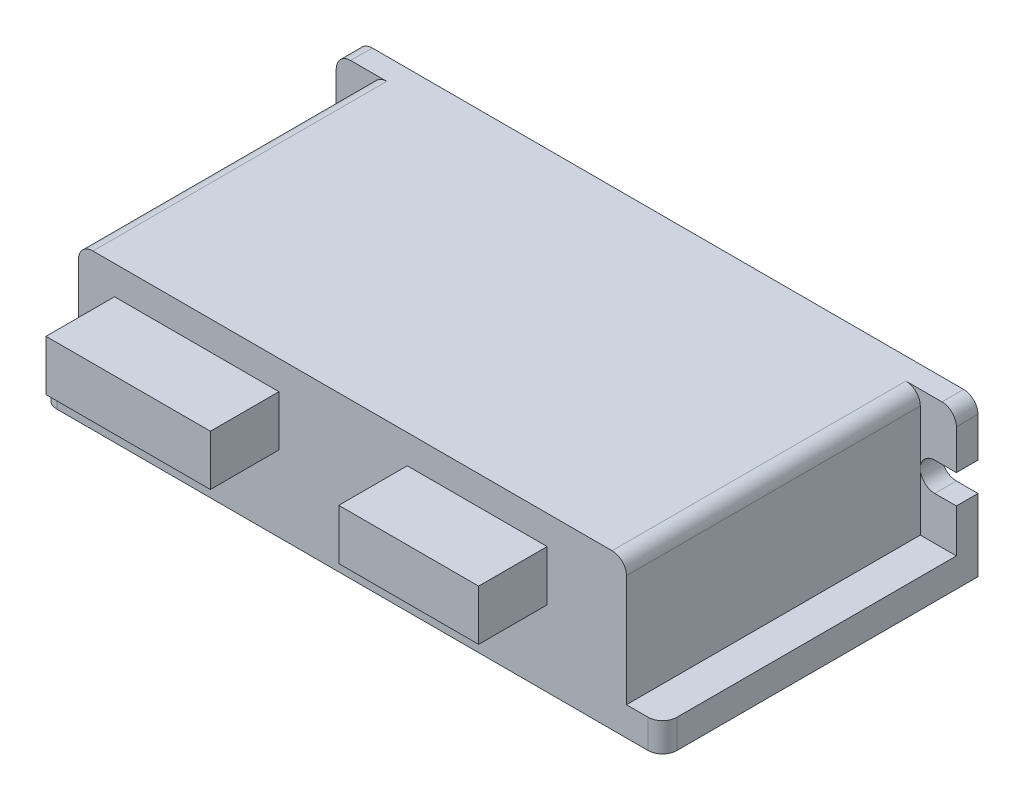
ISO-10303-21;
HEADER;
FILE_DESCRIPTION(('STEP AP214'),'2;1');
FILE_NAME('part.step','',(''),(''),'','','');
FILE_SCHEMA(('AUTOMOTIVE_DESIGN { 1 0 10303 214 1 1 1 1 }'));
ENDSEC;
DATA;
#1=APPLICATION_CONTEXT('core data for automotive mechanical design processes');
#2=APPLICATION_PROTOCOL_DEFINITION('international standard','automotive_design',2000,#1);
#3=PRODUCT_CONTEXT('',#1,'mechanical');
#4=PRODUCT('Part','Part','',(#3));
#5=PRODUCT_RELATED_PRODUCT_CATEGORY('part','',(#4));
#6=PRODUCT_DEFINITION_FORMATION('','',#4);
#7=PRODUCT_DEFINITION_CONTEXT('part definition',#1,'design');
#8=PRODUCT_DEFINITION('design','',#6,#7);
#9=PRODUCT_DEFINITION_SHAPE('','',#8);
#10=(LENGTH_UNIT() NAMED_UNIT(*) SI_UNIT(.MILLI.,.METRE.));
#11=(NAMED_UNIT(*) PLANE_ANGLE_UNIT() SI_UNIT($,.RADIAN.));
#12=(NAMED_UNIT(*) SI_UNIT($,.STERADIAN.) SOLID_ANGLE_UNIT());
#13=UNCERTAINTY_MEASURE_WITH_UNIT(LENGTH_MEASURE(1.E-05),#10,'distance_accuracy_value','');
#14=(GEOMETRIC_REPRESENTATION_CONTEXT(3) GLOBAL_UNCERTAINTY_ASSIGNED_CONTEXT((#13)) GLOBAL_UNIT_ASSIGNED_CONTEXT((#10,
#11,#12)) REPRESENTATION_CONTEXT('',''));
#15=CARTESIAN_POINT('',(0.,0.,0.));
#16=DIRECTION('',(0.,0.,1.));
#17=DIRECTION('',(1.,0.,0.));
#18=AXIS2_PLACEMENT_3D('',#15,#16,#17);
#19=CARTESIAN_POINT('',(0.,0.,43.75));
#20=DIRECTION('',(0.,0.,1.));
#21=DIRECTION('',(1.,0.,0.));
#22=AXIS2_PLACEMENT_3D('',#19,#20,#21);
#23=PLANE('',#22);
#24=DIRECTION('',(1.,0.,0.));
#25=VECTOR('',#24,1.);
#26=CARTESIAN_POINT('',(-43.,-6.75,43.75));
#27=LINE('',#26,#25);
#28=CARTESIAN_POINT('',(-41.,-6.75,43.75));
#29=VERTEX_POINT('',#28);
#30=CARTESIAN_POINT('',(-38.,-6.75,43.75));
#31=VERTEX_POINT('',#30);
#32=EDGE_CURVE('E354',#29,#31,#27,.T.);
#33=ORIENTED_EDGE('',*,*,#32,.F.);
#34=DIRECTION('',(0.,-1.,0.));
#35=VECTOR('',#34,1.);
#36=CARTESIAN_POINT('',(-41.,-10.75,43.75));
#37=LINE('',#36,#35);
#38=CARTESIAN_POINT('',(-41.,-10.75,43.75));
#39=VERTEX_POINT('',#38);
#40=EDGE_CURVE('E433',#29,#39,#37,.T.);
#41=ORIENTED_EDGE('',*,*,#40,.T.);
#42=DIRECTION('',(1.,0.,0.));
#43=VECTOR('',#42,1.);
#44=CARTESIAN_POINT('',(-43.,-10.75,43.75));
#45=LINE('',#44,#43);
#46=CARTESIAN_POINT('',(41.,-10.75,43.75));
#47=VERTEX_POINT('',#46);
#48=EDGE_CURVE('E392',#39,#47,#45,.T.);
#49=ORIENTED_EDGE('',*,*,#48,.T.);
#50=DIRECTION('',(0.,1.,0.));
#51=VECTOR('',#50,1.);
#52=CARTESIAN_POINT('',(41.,-6.75,43.75));
#53=LINE('',#52,#51);
#54=CARTESIAN_POINT('',(41.,-6.75,43.75));
#55=VERTEX_POINT('',#54);
#56=EDGE_CURVE('E430',#47,#55,#53,.T.);
#57=ORIENTED_EDGE('',*,*,#56,.T.);
#58=DIRECTION('',(1.,0.,0.));
#59=VECTOR('',#58,1.);
#60=CARTESIAN_POINT('',(43.,-6.75,43.75));
#61=LINE('',#60,#59);
#62=CARTESIAN_POINT('',(38.,-6.75,43.75));
#63=VERTEX_POINT('',#62);
#64=EDGE_CURVE('E378',#63,#55,#61,.T.);
#65=ORIENTED_EDGE('',*,*,#64,.F.);
#66=DIRECTION('',(0.,-1.,0.));
#67=VECTOR('',#66,1.);
#68=CARTESIAN_POINT('',(38.,10.75,43.75));
#69=LINE('',#68,#67);
#70=CARTESIAN_POINT('',(38.,8.75,43.75));
#71=VERTEX_POINT('',#70);
#72=EDGE_CURVE('E343',#71,#63,#69,.T.);
#73=ORIENTED_EDGE('',*,*,#72,.F.);
#74=CARTESIAN_POINT('',(36.,8.75,43.75));
#75=DIRECTION('',(0.,0.,1.));
#76=DIRECTION('',(1.,0.,0.));
#77=AXIS2_PLACEMENT_3D('',#74,#75,#76);
#78=CIRCLE('',#77,2.);
#79=CARTESIAN_POINT('',(36.,10.75,43.75));
#80=VERTEX_POINT('',#79);
#81=EDGE_CURVE('E426',#71,#80,#78,.T.);
#82=ORIENTED_EDGE('',*,*,#81,.T.);
#83=DIRECTION('',(-1.,0.,0.));
#84=VECTOR('',#83,1.);
#85=CARTESIAN_POINT('',(-43.,10.75,43.75));
#86=LINE('',#85,#84);
#87=CARTESIAN_POINT('',(-36.,10.75,43.75));
#88=VERTEX_POINT('',#87);
#89=EDGE_CURVE('E389',#80,#88,#86,.T.);
#90=ORIENTED_EDGE('',*,*,#89,.T.);
#91=CARTESIAN_POINT('',(-36.,8.75,43.75));
#92=DIRECTION('',(0.,0.,1.));
#93=DIRECTION('',(1.,0.,0.));
#94=AXIS2_PLACEMENT_3D('',#91,#92,#93);
#95=CIRCLE('',#94,2.);
#96=CARTESIAN_POINT('',(-38.,8.75,43.75));
#97=VERTEX_POINT('',#96);
#98=EDGE_CURVE('E428',#88,#97,#95,.T.);
#99=ORIENTED_EDGE('',*,*,#98,.T.);
#100=DIRECTION('',(0.,1.,0.));
#101=VECTOR('',#100,1.);
#102=CARTESIAN_POINT('',(-38.,10.75,43.75));
#103=LINE('',#102,#101);
#104=EDGE_CURVE('E356',#31,#97,#103,.T.);
#105=ORIENTED_EDGE('',*,*,#104,.F.);
#106=EDGE_LOOP('',(#33,#41,#49,#57,#65,#73,#82,#90,#99,#105));
#107=FACE_BOUND('',#106,.T.);
#108=DIRECTION('',(-1.,0.,0.));
#109=VECTOR('',#108,1.);
#110=CARTESIAN_POINT('',(-33.,6.75,43.75));
#111=LINE('',#110,#109);
#112=CARTESIAN_POINT('',(-10.2,6.75,43.75));
#113=VERTEX_POINT('',#112);
#114=CARTESIAN_POINT('',(-33.,6.75,43.75));
#115=VERTEX_POINT('',#114);
#116=EDGE_CURVE('E279',#113,#115,#111,.T.);
#117=ORIENTED_EDGE('',*,*,#116,.F.);
#118=DIRECTION('',(0.,1.,0.));
#119=VECTOR('',#118,1.);
#120=CARTESIAN_POINT('',(-10.2,6.75,43.75));
#121=LINE('',#120,#119);
#122=CARTESIAN_POINT('',(-10.2,-0.249999999999998,43.75));
#123=VERTEX_POINT('',#122);
#124=EDGE_CURVE('E276',#123,#113,#121,.T.);
#125=ORIENTED_EDGE('',*,*,#124,.F.);
#126=DIRECTION('',(1.,0.,0.));
#127=VECTOR('',#126,1.);
#128=CARTESIAN_POINT('',(-33.,-0.249999999999998,43.75));
#129=LINE('',#128,#127);
#130=CARTESIAN_POINT('',(-33.,-0.249999999999998,43.75));
#131=VERTEX_POINT('',#130);
#132=EDGE_CURVE('E288',#131,#123,#129,.T.);
#133=ORIENTED_EDGE('',*,*,#132,.F.);
#134=DIRECTION('',(0.,-1.,0.));
#135=VECTOR('',#134,1.);
#136=CARTESIAN_POINT('',(-33.,6.75,43.75));
#137=LINE('',#136,#135);
#138=EDGE_CURVE('E296',#115,#131,#137,.T.);
#139=ORIENTED_EDGE('',*,*,#138,.F.);
#140=EDGE_LOOP('',(#117,#125,#133,#139));
#141=FACE_BOUND('',#140,.T.);
#142=DIRECTION('',(-1.,0.,0.));
#143=VECTOR('',#142,1.);
#144=CARTESIAN_POINT('',(7.6,6.75,43.75));
#145=LINE('',#144,#143);
#146=CARTESIAN_POINT('',(27.,6.75,43.75));
#147=VERTEX_POINT('',#146);
#148=CARTESIAN_POINT('',(7.6,6.75,43.75));
#149=VERTEX_POINT('',#148);
#150=EDGE_CURVE('E791',#147,#149,#145,.T.);
#151=ORIENTED_EDGE('',*,*,#150,.F.);
#152=DIRECTION('',(0.,1.,0.));
#153=VECTOR('',#152,1.);
#154=CARTESIAN_POINT('',(27.,6.75,43.75));
#155=LINE('',#154,#153);
#156=CARTESIAN_POINT('',(27.,-0.249999999999999,43.75));
#157=VERTEX_POINT('',#156);
#158=EDGE_CURVE('E274',#157,#147,#155,.T.);
#159=ORIENTED_EDGE('',*,*,#158,.F.);
#160=DIRECTION('',(1.,0.,0.));
#161=VECTOR('',#160,1.);
#162=CARTESIAN_POINT('',(7.6,-0.249999999999998,43.75));
#163=LINE('',#162,#161);
#164=CARTESIAN_POINT('',(7.6,-0.249999999999998,43.75));
#165=VERTEX_POINT('',#164);
#166=EDGE_CURVE('E270',#165,#157,#163,.T.);
#167=ORIENTED_EDGE('',*,*,#166,.F.);
#168=DIRECTION('',(0.,-1.,0.));
#169=VECTOR('',#168,1.);
#170=CARTESIAN_POINT('',(7.6,6.75,43.75));
#171=LINE('',#170,#169);
#172=EDGE_CURVE('E788',#149,#165,#171,.T.);
#173=ORIENTED_EDGE('',*,*,#172,.F.);
#174=EDGE_LOOP('',(#151,#159,#167,#173));
#175=FACE_BOUND('',#174,.T.);
#176=ADVANCED_FACE('F36',(#107,#141,#175),#23,.T.);
#177=CARTESIAN_POINT('',(43.,10.75,43.75));
#178=DIRECTION('',(-1.,0.,0.));
#179=DIRECTION('',(0.,0.,1.));
#180=AXIS2_PLACEMENT_3D('',#177,#178,#179);
#181=PLANE('',#180);
#182=DIRECTION('',(0.,0.,1.));
#183=VECTOR('',#182,1.);
#184=CARTESIAN_POINT('',(43.,-6.75,-18.2002747232013));
#185=LINE('',#184,#183);
#186=CARTESIAN_POINT('',(43.,-6.75,3.));
#187=VERTEX_POINT('',#186);
#188=CARTESIAN_POINT('',(43.,-6.75,41.75));
#189=VERTEX_POINT('',#188);
#190=EDGE_CURVE('E382',#187,#189,#185,.T.);
#191=ORIENTED_EDGE('',*,*,#190,.T.);
#192=DIRECTION('',(0.,1.,0.));
#193=VECTOR('',#192,1.);
#194=CARTESIAN_POINT('',(43.,-10.75,41.75));
#195=LINE('',#194,#193);
#196=CARTESIAN_POINT('',(43.,-10.75,41.75));
#197=VERTEX_POINT('',#196);
#198=EDGE_CURVE('E446',#189,#197,#195,.F.);
#199=ORIENTED_EDGE('',*,*,#198,.T.);
#200=DIRECTION('',(0.,0.,-1.));
#201=VECTOR('',#200,1.);
#202=CARTESIAN_POINT('',(43.,-10.75,43.75));
#203=LINE('',#202,#201);
#204=CARTESIAN_POINT('',(43.,-10.75,0.));
#205=VERTEX_POINT('',#204);
#206=EDGE_CURVE('E396',#197,#205,#203,.T.);
#207=ORIENTED_EDGE('',*,*,#206,.T.);
#208=DIRECTION('',(0.,1.,0.));
#209=VECTOR('',#208,1.);
#210=CARTESIAN_POINT('',(43.,10.75,0.));
#211=LINE('',#210,#209);
#212=CARTESIAN_POINT('',(43.,-0.749999999999997,0.));
#213=VERTEX_POINT('',#212);
#214=EDGE_CURVE('E397',#205,#213,#211,.T.);
#215=ORIENTED_EDGE('',*,*,#214,.T.);
#216=DIRECTION('',(0.,0.,1.));
#217=VECTOR('',#216,1.);
#218=CARTESIAN_POINT('',(43.,-0.749999999999997,43.75));
#219=LINE('',#218,#217);
#220=CARTESIAN_POINT('',(43.,-0.749999999999997,3.));
#221=VERTEX_POINT('',#220);
#222=EDGE_CURVE('E340',#213,#221,#219,.T.);
#223=ORIENTED_EDGE('',*,*,#222,.T.);
#224=DIRECTION('',(0.,-1.,0.));
#225=VECTOR('',#224,1.);
#226=CARTESIAN_POINT('',(43.,10.75,3.));
#227=LINE('',#226,#225);
#228=EDGE_CURVE('E374',#221,#187,#227,.T.);
#229=ORIENTED_EDGE('',*,*,#228,.T.);
#230=EDGE_LOOP('',(#191,#199,#207,#215,#223,#229));
#231=FACE_BOUND('',#230,.T.);
#232=ADVANCED_FACE('F542',(#231),#181,.F.);
#233=CARTESIAN_POINT('',(-43.,10.75,43.75));
#234=DIRECTION('',(1.,0.,0.));
#235=DIRECTION('',(0.,0.,-1.));
#236=AXIS2_PLACEMENT_3D('',#233,#234,#235);
#237=PLANE('',#236);
#238=DIRECTION('',(0.,1.,0.));
#239=VECTOR('',#238,1.);
#240=CARTESIAN_POINT('',(-43.,10.75,3.));
#241=LINE('',#240,#239);
#242=CARTESIAN_POINT('',(-43.,3.25,3.));
#243=VERTEX_POINT('',#242);
#244=CARTESIAN_POINT('',(-43.,8.75,3.));
#245=VERTEX_POINT('',#244);
#246=EDGE_CURVE('E349',#243,#245,#241,.T.);
#247=ORIENTED_EDGE('',*,*,#246,.T.);
#248=DIRECTION('',(0.,0.,-1.));
#249=VECTOR('',#248,1.);
#250=CARTESIAN_POINT('',(-43.,8.75,43.75));
#251=LINE('',#250,#249);
#252=CARTESIAN_POINT('',(-43.,8.75,0.));
#253=VERTEX_POINT('',#252);
#254=EDGE_CURVE('E448',#245,#253,#251,.T.);
#255=ORIENTED_EDGE('',*,*,#254,.T.);
#256=DIRECTION('',(0.,-1.,0.));
#257=VECTOR('',#256,1.);
#258=CARTESIAN_POINT('',(-43.,10.75,0.));
#259=LINE('',#258,#257);
#260=CARTESIAN_POINT('',(-43.,3.25,0.));
#261=VERTEX_POINT('',#260);
#262=EDGE_CURVE('E404',#253,#261,#259,.T.);
#263=ORIENTED_EDGE('',*,*,#262,.T.);
#264=DIRECTION('',(0.,0.,1.));
#265=VECTOR('',#264,1.);
#266=CARTESIAN_POINT('',(-43.,3.25,43.75));
#267=LINE('',#266,#265);
#268=EDGE_CURVE('E334',#261,#243,#267,.T.);
#269=ORIENTED_EDGE('',*,*,#268,.T.);
#270=EDGE_LOOP('',(#247,#255,#263,#269));
#271=FACE_BOUND('',#270,.T.);
#272=ADVANCED_FACE('F587',(#271),#237,.F.);
#273=CARTESIAN_POINT('',(0.,0.,3.));
#274=DIRECTION('',(0.,0.,1.));
#275=DIRECTION('',(1.,0.,0.));
#276=AXIS2_PLACEMENT_3D('',#273,#274,#275);
#277=PLANE('',#276);
#278=DIRECTION('',(1.,0.,0.));
#279=VECTOR('',#278,1.);
#280=CARTESIAN_POINT('',(0.,-0.749999999999997,3.));
#281=LINE('',#280,#279);
#282=CARTESIAN_POINT('',(40.,-0.749999999999997,3.));
#283=VERTEX_POINT('',#282);
#284=EDGE_CURVE('E424',#283,#221,#281,.T.);
#285=ORIENTED_EDGE('',*,*,#284,.F.);
#286=CARTESIAN_POINT('',(40.,1.25,3.));
#287=DIRECTION('',(0.,0.,1.));
#288=DIRECTION('',(1.,0.,0.));
#289=AXIS2_PLACEMENT_3D('',#286,#287,#288);
#290=CIRCLE('',#289,2.);
#291=CARTESIAN_POINT('',(38.,1.25,3.));
#292=VERTEX_POINT('',#291);
#293=EDGE_CURVE('E423',#292,#283,#290,.T.);
#294=ORIENTED_EDGE('',*,*,#293,.F.);
#295=DIRECTION('',(0.,1.,0.));
#296=VECTOR('',#295,1.);
#297=CARTESIAN_POINT('',(38.,10.75,3.));
#298=LINE('',#297,#296);
#299=CARTESIAN_POINT('',(38.,-6.74999999999999,3.));
#300=VERTEX_POINT('',#299);
#301=EDGE_CURVE('E368',#300,#292,#298,.T.);
#302=ORIENTED_EDGE('',*,*,#301,.F.);
#303=DIRECTION('',(-1.,0.,0.));
#304=VECTOR('',#303,1.);
#305=CARTESIAN_POINT('',(43.,-6.75,3.));
#306=LINE('',#305,#304);
#307=EDGE_CURVE('E371',#187,#300,#306,.T.);
#308=ORIENTED_EDGE('',*,*,#307,.F.);
#309=ORIENTED_EDGE('',*,*,#228,.F.);
#310=EDGE_LOOP('',(#285,#294,#302,#308,#309));
#311=FACE_BOUND('',#310,.T.);
#312=ADVANCED_FACE('F545',(#311),#277,.T.);
#313=CARTESIAN_POINT('',(0.,0.,3.));
#314=DIRECTION('',(0.,0.,1.));
#315=DIRECTION('',(1.,0.,0.));
#316=AXIS2_PLACEMENT_3D('',#313,#314,#315);
#317=PLANE('',#316);
#318=DIRECTION('',(1.,0.,0.));
#319=VECTOR('',#318,1.);
#320=CARTESIAN_POINT('',(-43.,10.75,3.));
#321=LINE('',#320,#319);
#322=CARTESIAN_POINT('',(-41.,10.75,3.));
#323=VERTEX_POINT('',#322);
#324=CARTESIAN_POINT('',(-36.,10.75,3.));
#325=VERTEX_POINT('',#324);
#326=EDGE_CURVE('E346',#323,#325,#321,.T.);
#327=ORIENTED_EDGE('',*,*,#326,.F.);
#328=CARTESIAN_POINT('',(-41.,8.75,3.));
#329=DIRECTION('',(0.,0.,1.));
#330=DIRECTION('',(1.,0.,0.));
#331=AXIS2_PLACEMENT_3D('',#328,#329,#330);
#332=CIRCLE('',#331,2.);
#333=EDGE_CURVE('E466',#323,#245,#332,.T.);
#334=ORIENTED_EDGE('',*,*,#333,.T.);
#335=ORIENTED_EDGE('',*,*,#246,.F.);
#336=DIRECTION('',(-1.,0.,0.));
#337=VECTOR('',#336,1.);
#338=CARTESIAN_POINT('',(0.,3.25,3.));
#339=LINE('',#338,#337);
#340=CARTESIAN_POINT('',(-40.,3.25,3.));
#341=VERTEX_POINT('',#340);
#342=EDGE_CURVE('E417',#341,#243,#339,.T.);
#343=ORIENTED_EDGE('',*,*,#342,.F.);
#344=CARTESIAN_POINT('',(-40.,1.25,3.));
#345=DIRECTION('',(0.,0.,1.));
#346=DIRECTION('',(1.,0.,0.));
#347=AXIS2_PLACEMENT_3D('',#344,#345,#346);
#348=CIRCLE('',#347,2.);
#349=CARTESIAN_POINT('',(-38.,1.25,3.));
#350=VERTEX_POINT('',#349);
#351=EDGE_CURVE('E416',#350,#341,#348,.T.);
#352=ORIENTED_EDGE('',*,*,#351,.F.);
#353=DIRECTION('',(0.,-1.,0.));
#354=VECTOR('',#353,1.);
#355=CARTESIAN_POINT('',(-38.,10.75,3.));
#356=LINE('',#355,#354);
#357=CARTESIAN_POINT('',(-38.,8.75,3.));
#358=VERTEX_POINT('',#357);
#359=EDGE_CURVE('E344',#358,#350,#356,.T.);
#360=ORIENTED_EDGE('',*,*,#359,.F.);
#361=CARTESIAN_POINT('',(-36.,8.75,3.));
#362=DIRECTION('',(0.,0.,1.));
#363=DIRECTION('',(1.,0.,0.));
#364=AXIS2_PLACEMENT_3D('',#361,#362,#363);
#365=CIRCLE('',#364,2.);
#366=EDGE_CURVE('E44',#358,#325,#365,.F.);
#367=ORIENTED_EDGE('',*,*,#366,.T.);
#368=EDGE_LOOP('',(#327,#334,#335,#343,#352,#360,#367));
#369=FACE_BOUND('',#368,.T.);
#370=ADVANCED_FACE('F482',(#369),#317,.T.);
#371=CARTESIAN_POINT('',(43.,3.25,0.));
#372=VERTEX_POINT('',#371);
#373=CARTESIAN_POINT('',(43.,8.75,0.));
#374=VERTEX_POINT('',#373);
#375=EDGE_CURVE('E367',#372,#374,#211,.T.);
#376=ORIENTED_EDGE('',*,*,#375,.T.);
#377=DIRECTION('',(0.,0.,-1.));
#378=VECTOR('',#377,1.);
#379=CARTESIAN_POINT('',(43.,8.75,43.75));
#380=LINE('',#379,#378);
#381=CARTESIAN_POINT('',(43.,8.75,3.));
#382=VERTEX_POINT('',#381);
#383=EDGE_CURVE('E468',#374,#382,#380,.F.);
#384=ORIENTED_EDGE('',*,*,#383,.T.);
#385=CARTESIAN_POINT('',(43.,3.25,3.));
#386=VERTEX_POINT('',#385);
#387=EDGE_CURVE('E375',#382,#386,#227,.T.);
#388=ORIENTED_EDGE('',*,*,#387,.T.);
#389=DIRECTION('',(0.,0.,-1.));
#390=VECTOR('',#389,1.);
#391=CARTESIAN_POINT('',(43.,3.25,43.75));
#392=LINE('',#391,#390);
#393=EDGE_CURVE('E337',#386,#372,#392,.T.);
#394=ORIENTED_EDGE('',*,*,#393,.T.);
#395=EDGE_LOOP('',(#376,#384,#388,#394));
#396=FACE_BOUND('',#395,.T.);
#397=ADVANCED_FACE('F525',(#396),#181,.F.);
#398=CARTESIAN_POINT('',(-43.,10.75,43.75));
#399=DIRECTION('',(0.,-1.,0.));
#400=DIRECTION('',(0.,0.,-1.));
#401=AXIS2_PLACEMENT_3D('',#398,#399,#400);
#402=PLANE('',#401);
#403=DIRECTION('',(-1.,0.,0.));
#404=VECTOR('',#403,1.);
#405=CARTESIAN_POINT('',(-43.,10.75,0.));
#406=LINE('',#405,#404);
#407=CARTESIAN_POINT('',(41.,10.75,0.));
#408=VERTEX_POINT('',#407);
#409=CARTESIAN_POINT('',(-41.,10.75,0.));
#410=VERTEX_POINT('',#409);
#411=EDGE_CURVE('E400',#408,#410,#406,.T.);
#412=ORIENTED_EDGE('',*,*,#411,.T.);
#413=DIRECTION('',(0.,0.,-1.));
#414=VECTOR('',#413,1.);
#415=CARTESIAN_POINT('',(-41.,10.75,43.75));
#416=LINE('',#415,#414);
#417=EDGE_CURVE('E464',#410,#323,#416,.F.);
#418=ORIENTED_EDGE('',*,*,#417,.T.);
#419=ORIENTED_EDGE('',*,*,#326,.T.);
#420=DIRECTION('',(0.,0.,1.));
#421=VECTOR('',#420,1.);
#422=CARTESIAN_POINT('',(-36.,10.75,43.75));
#423=LINE('',#422,#421);
#424=EDGE_CURVE('E458',#325,#88,#423,.T.);
#425=ORIENTED_EDGE('',*,*,#424,.T.);
#426=ORIENTED_EDGE('',*,*,#89,.F.);
#427=DIRECTION('',(0.,0.,1.));
#428=VECTOR('',#427,1.);
#429=CARTESIAN_POINT('',(36.,10.75,43.75));
#430=LINE('',#429,#428);
#431=CARTESIAN_POINT('',(36.,10.75,3.));
#432=VERTEX_POINT('',#431);
#433=EDGE_CURVE('E455',#80,#432,#430,.F.);
#434=ORIENTED_EDGE('',*,*,#433,.T.);
#435=DIRECTION('',(1.,0.,0.));
#436=VECTOR('',#435,1.);
#437=CARTESIAN_POINT('',(43.,10.75,3.));
#438=LINE('',#437,#436);
#439=CARTESIAN_POINT('',(41.,10.75,3.));
#440=VERTEX_POINT('',#439);
#441=EDGE_CURVE('E357',#432,#440,#438,.T.);
#442=ORIENTED_EDGE('',*,*,#441,.T.);
#443=DIRECTION('',(0.,0.,-1.));
#444=VECTOR('',#443,1.);
#445=CARTESIAN_POINT('',(41.,10.75,43.75));
#446=LINE('',#445,#444);
#447=EDGE_CURVE('E461',#440,#408,#446,.T.);
#448=ORIENTED_EDGE('',*,*,#447,.T.);
#449=EDGE_LOOP('',(#412,#418,#419,#425,#426,#434,#442,#448));
#450=FACE_BOUND('',#449,.T.);
#451=ADVANCED_FACE('F490',(#450),#402,.F.);
#452=DIRECTION('',(0.,0.,-1.));
#453=VECTOR('',#452,1.);
#454=CARTESIAN_POINT('',(-43.,-10.75,43.75));
#455=LINE('',#454,#453);
#456=CARTESIAN_POINT('',(-43.,-10.75,41.75));
#457=VERTEX_POINT('',#456);
#458=CARTESIAN_POINT('',(-43.,-10.75,0.));
#459=VERTEX_POINT('',#458);
#460=EDGE_CURVE('E409',#457,#459,#455,.T.);
#461=ORIENTED_EDGE('',*,*,#460,.F.);
#462=DIRECTION('',(0.,-1.,0.));
#463=VECTOR('',#462,1.);
#464=CARTESIAN_POINT('',(-43.,-6.75,41.75));
#465=LINE('',#464,#463);
#466=CARTESIAN_POINT('',(-43.,-6.75,41.75));
#467=VERTEX_POINT('',#466);
#468=EDGE_CURVE('E440',#457,#467,#465,.F.);
#469=ORIENTED_EDGE('',*,*,#468,.T.);
#470=DIRECTION('',(0.,0.,1.));
#471=VECTOR('',#470,1.);
#472=CARTESIAN_POINT('',(-43.,-6.75,-18.2002747232013));
#473=LINE('',#472,#471);
#474=CARTESIAN_POINT('',(-43.,-6.75,3.));
#475=VERTEX_POINT('',#474);
#476=EDGE_CURVE('E360',#475,#467,#473,.T.);
#477=ORIENTED_EDGE('',*,*,#476,.F.);
#478=CARTESIAN_POINT('',(-43.,-0.749999999999997,3.));
#479=VERTEX_POINT('',#478);
#480=EDGE_CURVE('E350',#475,#479,#241,.T.);
#481=ORIENTED_EDGE('',*,*,#480,.T.);
#482=DIRECTION('',(0.,0.,-1.));
#483=VECTOR('',#482,1.);
#484=CARTESIAN_POINT('',(-43.,-0.749999999999997,43.75));
#485=LINE('',#484,#483);
#486=CARTESIAN_POINT('',(-43.,-0.749999999999997,0.));
#487=VERTEX_POINT('',#486);
#488=EDGE_CURVE('E320',#479,#487,#485,.T.);
#489=ORIENTED_EDGE('',*,*,#488,.T.);
#490=EDGE_CURVE('E403',#487,#459,#259,.T.);
#491=ORIENTED_EDGE('',*,*,#490,.T.);
#492=EDGE_LOOP('',(#461,#469,#477,#481,#489,#491));
#493=FACE_BOUND('',#492,.T.);
#494=ADVANCED_FACE('F566',(#493),#237,.F.);
#495=CARTESIAN_POINT('',(-43.,-10.75,43.75));
#496=DIRECTION('',(0.,1.,0.));
#497=DIRECTION('',(0.,0.,1.));
#498=AXIS2_PLACEMENT_3D('',#495,#496,#497);
#499=PLANE('',#498);
#500=ORIENTED_EDGE('',*,*,#48,.F.);
#501=CARTESIAN_POINT('',(-41.,-10.75,41.75));
#502=DIRECTION('',(0.,1.,0.));
#503=DIRECTION('',(0.,0.,1.));
#504=AXIS2_PLACEMENT_3D('',#501,#502,#503);
#505=CIRCLE('',#504,2.);
#506=EDGE_CURVE('E438',#39,#457,#505,.F.);
#507=ORIENTED_EDGE('',*,*,#506,.T.);
#508=ORIENTED_EDGE('',*,*,#460,.T.);
#509=DIRECTION('',(1.,0.,0.));
#510=VECTOR('',#509,1.);
#511=CARTESIAN_POINT('',(-43.,-10.75,0.));
#512=LINE('',#511,#510);
#513=EDGE_CURVE('E393',#459,#205,#512,.T.);
#514=ORIENTED_EDGE('',*,*,#513,.T.);
#515=ORIENTED_EDGE('',*,*,#206,.F.);
#516=CARTESIAN_POINT('',(41.,-10.75,41.75));
#517=DIRECTION('',(0.,1.,0.));
#518=DIRECTION('',(0.,0.,1.));
#519=AXIS2_PLACEMENT_3D('',#516,#517,#518);
#520=CIRCLE('',#519,2.);
#521=EDGE_CURVE('E436',#197,#47,#520,.F.);
#522=ORIENTED_EDGE('',*,*,#521,.T.);
#523=EDGE_LOOP('',(#500,#507,#508,#514,#515,#522));
#524=FACE_BOUND('',#523,.T.);
#525=ADVANCED_FACE('F557',(#524),#499,.F.);
#526=CARTESIAN_POINT('',(0.,0.,0.));
#527=DIRECTION('',(0.,0.,1.));
#528=DIRECTION('',(1.,0.,0.));
#529=AXIS2_PLACEMENT_3D('',#526,#527,#528);
#530=PLANE('',#529);
#531=ORIENTED_EDGE('',*,*,#262,.F.);
#532=CARTESIAN_POINT('',(-41.,8.75,0.));
#533=DIRECTION('',(0.,0.,1.));
#534=DIRECTION('',(1.,0.,0.));
#535=AXIS2_PLACEMENT_3D('',#532,#533,#534);
#536=CIRCLE('',#535,2.);
#537=EDGE_CURVE('E453',#253,#410,#536,.F.);
#538=ORIENTED_EDGE('',*,*,#537,.T.);
#539=ORIENTED_EDGE('',*,*,#411,.F.);
#540=CARTESIAN_POINT('',(41.,8.75,0.));
#541=DIRECTION('',(0.,0.,1.));
#542=DIRECTION('',(1.,0.,0.));
#543=AXIS2_PLACEMENT_3D('',#540,#541,#542);
#544=CIRCLE('',#543,2.);
#545=EDGE_CURVE('E451',#408,#374,#544,.F.);
#546=ORIENTED_EDGE('',*,*,#545,.T.);
#547=ORIENTED_EDGE('',*,*,#375,.F.);
#548=DIRECTION('',(1.,0.,0.));
#549=VECTOR('',#548,1.);
#550=CARTESIAN_POINT('',(40.,3.25,0.));
#551=LINE('',#550,#549);
#552=CARTESIAN_POINT('',(40.,3.25,0.));
#553=VERTEX_POINT('',#552);
#554=EDGE_CURVE('E324',#553,#372,#551,.T.);
#555=ORIENTED_EDGE('',*,*,#554,.F.);
#556=CARTESIAN_POINT('',(40.,1.25,0.));
#557=DIRECTION('',(0.,0.,-1.));
#558=DIRECTION('',(1.,0.,0.));
#559=AXIS2_PLACEMENT_3D('',#556,#557,#558);
#560=CIRCLE('',#559,2.);
#561=CARTESIAN_POINT('',(40.,-0.749999999999997,0.));
#562=VERTEX_POINT('',#561);
#563=EDGE_CURVE('E307',#562,#553,#560,.T.);
#564=ORIENTED_EDGE('',*,*,#563,.F.);
#565=DIRECTION('',(-1.,0.,0.));
#566=VECTOR('',#565,1.);
#567=CARTESIAN_POINT('',(40.,-0.749999999999997,0.));
#568=LINE('',#567,#566);
#569=EDGE_CURVE('E326',#213,#562,#568,.T.);
#570=ORIENTED_EDGE('',*,*,#569,.F.);
#571=ORIENTED_EDGE('',*,*,#214,.F.);
#572=ORIENTED_EDGE('',*,*,#513,.F.);
#573=ORIENTED_EDGE('',*,*,#490,.F.);
#574=DIRECTION('',(-1.,0.,0.));
#575=VECTOR('',#574,1.);
#576=CARTESIAN_POINT('',(-40.,-0.749999999999997,0.));
#577=LINE('',#576,#575);
#578=CARTESIAN_POINT('',(-40.,-0.749999999999997,0.));
#579=VERTEX_POINT('',#578);
#580=EDGE_CURVE('E311',#579,#487,#577,.T.);
#581=ORIENTED_EDGE('',*,*,#580,.F.);
#582=CARTESIAN_POINT('',(-40.,1.25,0.));
#583=DIRECTION('',(0.,0.,-1.));
#584=DIRECTION('',(-1.,0.,0.));
#585=AXIS2_PLACEMENT_3D('',#582,#583,#584);
#586=CIRCLE('',#585,2.);
#587=CARTESIAN_POINT('',(-40.,3.25,0.));
#588=VERTEX_POINT('',#587);
#589=EDGE_CURVE('E308',#588,#579,#586,.T.);
#590=ORIENTED_EDGE('',*,*,#589,.F.);
#591=DIRECTION('',(1.,0.,0.));
#592=VECTOR('',#591,1.);
#593=CARTESIAN_POINT('',(-40.,3.25,0.));
#594=LINE('',#593,#592);
#595=EDGE_CURVE('E314',#261,#588,#594,.T.);
#596=ORIENTED_EDGE('',*,*,#595,.F.);
#597=EDGE_LOOP('',(#531,#538,#539,#546,#547,#555,#564,#570,#571,#572,#573,#581,#590,#596));
#598=FACE_BOUND('',#597,.T.);
#599=ADVANCED_FACE('F522',(#598),#530,.F.);
#600=CARTESIAN_POINT('',(43.,-6.75,-18.2002747232013));
#601=DIRECTION('',(0.,-1.,0.));
#602=DIRECTION('',(1.,0.,0.));
#603=AXIS2_PLACEMENT_3D('',#600,#601,#602);
#604=PLANE('',#603);
#605=ORIENTED_EDGE('',*,*,#64,.T.);
#606=CARTESIAN_POINT('',(41.,-6.75,41.75));
#607=DIRECTION('',(0.,-1.,0.));
#608=DIRECTION('',(1.,0.,0.));
#609=AXIS2_PLACEMENT_3D('',#606,#607,#608);
#610=CIRCLE('',#609,2.);
#611=EDGE_CURVE('E444',#55,#189,#610,.F.);
#612=ORIENTED_EDGE('',*,*,#611,.T.);
#613=ORIENTED_EDGE('',*,*,#190,.F.);
#614=ORIENTED_EDGE('',*,*,#307,.T.);
#615=DIRECTION('',(0.,0.,1.));
#616=VECTOR('',#615,1.);
#617=CARTESIAN_POINT('',(38.,-6.75,-18.2002747232013));
#618=LINE('',#617,#616);
#619=EDGE_CURVE('E381',#300,#63,#618,.T.);
#620=ORIENTED_EDGE('',*,*,#619,.T.);
#621=EDGE_LOOP('',(#605,#612,#613,#614,#620));
#622=FACE_BOUND('',#621,.T.);
#623=ADVANCED_FACE('F548',(#622),#604,.F.);
#624=CARTESIAN_POINT('',(38.,10.75,-18.2002747232013));
#625=DIRECTION('',(-1.,0.,0.));
#626=DIRECTION('',(0.,0.,1.));
#627=AXIS2_PLACEMENT_3D('',#624,#625,#626);
#628=PLANE('',#627);
#629=CARTESIAN_POINT('',(38.,8.75,3.));
#630=VERTEX_POINT('',#629);
#631=EDGE_CURVE('E372',#292,#630,#298,.T.);
#632=ORIENTED_EDGE('',*,*,#631,.T.);
#633=DIRECTION('',(0.,0.,1.));
#634=VECTOR('',#633,1.);
#635=CARTESIAN_POINT('',(38.,8.75,-18.2002747232013));
#636=LINE('',#635,#634);
#637=EDGE_CURVE('E474',#630,#71,#636,.T.);
#638=ORIENTED_EDGE('',*,*,#637,.T.);
#639=ORIENTED_EDGE('',*,*,#72,.T.);
#640=ORIENTED_EDGE('',*,*,#619,.F.);
#641=ORIENTED_EDGE('',*,*,#301,.T.);
#642=EDGE_LOOP('',(#632,#638,#639,#640,#641));
#643=FACE_BOUND('',#642,.T.);
#644=ADVANCED_FACE('F503',(#643),#628,.F.);
#645=ORIENTED_EDGE('',*,*,#387,.F.);
#646=CARTESIAN_POINT('',(41.,8.75,3.));
#647=DIRECTION('',(0.,0.,1.));
#648=DIRECTION('',(1.,0.,0.));
#649=AXIS2_PLACEMENT_3D('',#646,#647,#648);
#650=CIRCLE('',#649,2.);
#651=EDGE_CURVE('E470',#382,#440,#650,.T.);
#652=ORIENTED_EDGE('',*,*,#651,.T.);
#653=ORIENTED_EDGE('',*,*,#441,.F.);
#654=CARTESIAN_POINT('',(36.,8.75,3.));
#655=DIRECTION('',(0.,0.,1.));
#656=DIRECTION('',(1.,0.,0.));
#657=AXIS2_PLACEMENT_3D('',#654,#655,#656);
#658=CIRCLE('',#657,2.);
#659=EDGE_CURVE('E12',#432,#630,#658,.F.);
#660=ORIENTED_EDGE('',*,*,#659,.T.);
#661=ORIENTED_EDGE('',*,*,#631,.F.);
#662=CARTESIAN_POINT('',(40.,3.25,3.));
#663=VERTEX_POINT('',#662);
#664=EDGE_CURVE('E421',#663,#292,#290,.T.);
#665=ORIENTED_EDGE('',*,*,#664,.F.);
#666=DIRECTION('',(-1.,0.,0.));
#667=VECTOR('',#666,1.);
#668=CARTESIAN_POINT('',(0.,3.25,3.));
#669=LINE('',#668,#667);
#670=EDGE_CURVE('E419',#386,#663,#669,.T.);
#671=ORIENTED_EDGE('',*,*,#670,.F.);
#672=EDGE_LOOP('',(#645,#652,#653,#660,#661,#665,#671));
#673=FACE_BOUND('',#672,.T.);
#674=ADVANCED_FACE('F510',(#673),#277,.T.);
#675=CARTESIAN_POINT('',(-38.,10.75,-18.2002747232013));
#676=DIRECTION('',(1.,0.,0.));
#677=DIRECTION('',(0.,0.,-1.));
#678=AXIS2_PLACEMENT_3D('',#675,#676,#677);
#679=PLANE('',#678);
#680=ORIENTED_EDGE('',*,*,#104,.T.);
#681=DIRECTION('',(0.,0.,1.));
#682=VECTOR('',#681,1.);
#683=CARTESIAN_POINT('',(-38.,8.75,-18.2002747232013));
#684=LINE('',#683,#682);
#685=EDGE_CURVE('E472',#97,#358,#684,.F.);
#686=ORIENTED_EDGE('',*,*,#685,.T.);
#687=ORIENTED_EDGE('',*,*,#359,.T.);
#688=CARTESIAN_POINT('',(-38.,-6.75,3.));
#689=VERTEX_POINT('',#688);
#690=EDGE_CURVE('E347',#350,#689,#356,.T.);
#691=ORIENTED_EDGE('',*,*,#690,.T.);
#692=DIRECTION('',(0.,0.,1.));
#693=VECTOR('',#692,1.);
#694=CARTESIAN_POINT('',(-38.,-6.75,-18.2002747232013));
#695=LINE('',#694,#693);
#696=EDGE_CURVE('E361',#689,#31,#695,.T.);
#697=ORIENTED_EDGE('',*,*,#696,.T.);
#698=EDGE_LOOP('',(#680,#686,#687,#691,#697));
#699=FACE_BOUND('',#698,.T.);
#700=ADVANCED_FACE('F600',(#699),#679,.F.);
#701=CARTESIAN_POINT('',(-43.,-6.75,-18.2002747232013));
#702=DIRECTION('',(0.,-1.,0.));
#703=DIRECTION('',(0.,0.,-1.));
#704=AXIS2_PLACEMENT_3D('',#701,#702,#703);
#705=PLANE('',#704);
#706=ORIENTED_EDGE('',*,*,#476,.T.);
#707=CARTESIAN_POINT('',(-41.,-6.75,41.75));
#708=DIRECTION('',(0.,-1.,0.));
#709=DIRECTION('',(0.,0.,-1.));
#710=AXIS2_PLACEMENT_3D('',#707,#708,#709);
#711=CIRCLE('',#710,2.);
#712=EDGE_CURVE('E442',#467,#29,#711,.F.);
#713=ORIENTED_EDGE('',*,*,#712,.T.);
#714=ORIENTED_EDGE('',*,*,#32,.T.);
#715=ORIENTED_EDGE('',*,*,#696,.F.);
#716=DIRECTION('',(-1.,0.,0.));
#717=VECTOR('',#716,1.);
#718=CARTESIAN_POINT('',(-43.,-6.75,3.));
#719=LINE('',#718,#717);
#720=EDGE_CURVE('E353',#689,#475,#719,.T.);
#721=ORIENTED_EDGE('',*,*,#720,.T.);
#722=EDGE_LOOP('',(#706,#713,#714,#715,#721));
#723=FACE_BOUND('',#722,.T.);
#724=ADVANCED_FACE('F602',(#723),#705,.F.);
#725=CARTESIAN_POINT('',(-40.,-0.749999999999997,3.));
#726=VERTEX_POINT('',#725);
#727=EDGE_CURVE('E413',#726,#350,#348,.T.);
#728=ORIENTED_EDGE('',*,*,#727,.F.);
#729=DIRECTION('',(1.,0.,0.));
#730=VECTOR('',#729,1.);
#731=CARTESIAN_POINT('',(0.,-0.749999999999997,3.));
#732=LINE('',#731,#730);
#733=EDGE_CURVE('E411',#479,#726,#732,.T.);
#734=ORIENTED_EDGE('',*,*,#733,.F.);
#735=ORIENTED_EDGE('',*,*,#480,.F.);
#736=ORIENTED_EDGE('',*,*,#720,.F.);
#737=ORIENTED_EDGE('',*,*,#690,.F.);
#738=EDGE_LOOP('',(#728,#734,#735,#736,#737));
#739=FACE_BOUND('',#738,.T.);
#740=ADVANCED_FACE('F596',(#739),#317,.T.);
#741=CARTESIAN_POINT('',(-40.,3.25,43.75));
#742=DIRECTION('',(0.,1.,0.));
#743=DIRECTION('',(0.,0.,1.));
#744=AXIS2_PLACEMENT_3D('',#741,#742,#743);
#745=PLANE('',#744);
#746=ORIENTED_EDGE('',*,*,#595,.T.);
#747=DIRECTION('',(0.,0.,-1.));
#748=VECTOR('',#747,1.);
#749=CARTESIAN_POINT('',(-40.,3.25,43.75));
#750=LINE('',#749,#748);
#751=EDGE_CURVE('E318',#341,#588,#750,.T.);
#752=ORIENTED_EDGE('',*,*,#751,.F.);
#753=ORIENTED_EDGE('',*,*,#342,.T.);
#754=ORIENTED_EDGE('',*,*,#268,.F.);
#755=EDGE_LOOP('',(#746,#752,#753,#754));
#756=FACE_BOUND('',#755,.T.);
#757=ADVANCED_FACE('F584',(#756),#745,.F.);
#758=CARTESIAN_POINT('',(-40.,-0.749999999999997,43.75));
#759=DIRECTION('',(0.,-1.,0.));
#760=DIRECTION('',(0.,0.,-1.));
#761=AXIS2_PLACEMENT_3D('',#758,#759,#760);
#762=PLANE('',#761);
#763=ORIENTED_EDGE('',*,*,#733,.T.);
#764=DIRECTION('',(0.,0.,-1.));
#765=VECTOR('',#764,1.);
#766=CARTESIAN_POINT('',(-40.,-0.749999999999997,43.75));
#767=LINE('',#766,#765);
#768=EDGE_CURVE('E317',#726,#579,#767,.T.);
#769=ORIENTED_EDGE('',*,*,#768,.T.);
#770=ORIENTED_EDGE('',*,*,#580,.T.);
#771=ORIENTED_EDGE('',*,*,#488,.F.);
#772=EDGE_LOOP('',(#763,#769,#770,#771));
#773=FACE_BOUND('',#772,.T.);
#774=ADVANCED_FACE('F574',(#773),#762,.F.);
#775=CARTESIAN_POINT('',(-40.,1.25,43.75));
#776=DIRECTION('',(0.,0.,-1.));
#777=DIRECTION('',(-1.,0.,0.));
#778=AXIS2_PLACEMENT_3D('',#775,#776,#777);
#779=CYLINDRICAL_SURFACE('',#778,2.);
#780=ORIENTED_EDGE('',*,*,#727,.T.);
#781=ORIENTED_EDGE('',*,*,#351,.T.);
#782=ORIENTED_EDGE('',*,*,#751,.T.);
#783=ORIENTED_EDGE('',*,*,#589,.T.);
#784=ORIENTED_EDGE('',*,*,#768,.F.);
#785=EDGE_LOOP('',(#780,#781,#782,#783,#784));
#786=FACE_BOUND('',#785,.T.);
#787=ADVANCED_FACE('F579',(#786),#779,.F.);
#788=CARTESIAN_POINT('',(40.,-0.749999999999997,43.75));
#789=DIRECTION('',(0.,-1.,0.));
#790=DIRECTION('',(0.,0.,-1.));
#791=AXIS2_PLACEMENT_3D('',#788,#789,#790);
#792=PLANE('',#791);
#793=ORIENTED_EDGE('',*,*,#569,.T.);
#794=DIRECTION('',(0.,0.,-1.));
#795=VECTOR('',#794,1.);
#796=CARTESIAN_POINT('',(40.,-0.749999999999997,43.75));
#797=LINE('',#796,#795);
#798=EDGE_CURVE('E312',#283,#562,#797,.T.);
#799=ORIENTED_EDGE('',*,*,#798,.F.);
#800=ORIENTED_EDGE('',*,*,#284,.T.);
#801=ORIENTED_EDGE('',*,*,#222,.F.);
#802=EDGE_LOOP('',(#793,#799,#800,#801));
#803=FACE_BOUND('',#802,.T.);
#804=ADVANCED_FACE('F539',(#803),#792,.F.);
#805=CARTESIAN_POINT('',(40.,3.25,43.75));
#806=DIRECTION('',(0.,1.,0.));
#807=DIRECTION('',(0.,0.,1.));
#808=AXIS2_PLACEMENT_3D('',#805,#806,#807);
#809=PLANE('',#808);
#810=ORIENTED_EDGE('',*,*,#670,.T.);
#811=DIRECTION('',(0.,0.,-1.));
#812=VECTOR('',#811,1.);
#813=CARTESIAN_POINT('',(40.,3.25,43.75));
#814=LINE('',#813,#812);
#815=EDGE_CURVE('E329',#663,#553,#814,.T.);
#816=ORIENTED_EDGE('',*,*,#815,.T.);
#817=ORIENTED_EDGE('',*,*,#554,.T.);
#818=ORIENTED_EDGE('',*,*,#393,.F.);
#819=EDGE_LOOP('',(#810,#816,#817,#818));
#820=FACE_BOUND('',#819,.T.);
#821=ADVANCED_FACE('F528',(#820),#809,.F.);
#822=CARTESIAN_POINT('',(40.,1.25,43.75));
#823=DIRECTION('',(0.,0.,-1.));
#824=DIRECTION('',(-1.,0.,0.));
#825=AXIS2_PLACEMENT_3D('',#822,#823,#824);
#826=CYLINDRICAL_SURFACE('',#825,2.);
#827=ORIENTED_EDGE('',*,*,#664,.T.);
#828=ORIENTED_EDGE('',*,*,#293,.T.);
#829=ORIENTED_EDGE('',*,*,#798,.T.);
#830=ORIENTED_EDGE('',*,*,#563,.T.);
#831=ORIENTED_EDGE('',*,*,#815,.F.);
#832=EDGE_LOOP('',(#827,#828,#829,#830,#831));
#833=FACE_BOUND('',#832,.T.);
#834=ADVANCED_FACE('F534',(#833),#826,.F.);
#835=CARTESIAN_POINT('',(-41.,0.,41.75));
#836=DIRECTION('',(0.,1.,0.));
#837=DIRECTION('',(0.,0.,1.));
#838=AXIS2_PLACEMENT_3D('',#835,#836,#837);
#839=CYLINDRICAL_SURFACE('',#838,2.);
#840=ORIENTED_EDGE('',*,*,#712,.F.);
#841=ORIENTED_EDGE('',*,*,#468,.F.);
#842=ORIENTED_EDGE('',*,*,#506,.F.);
#843=ORIENTED_EDGE('',*,*,#40,.F.);
#844=EDGE_LOOP('',(#840,#841,#842,#843));
#845=FACE_BOUND('',#844,.T.);
#846=ADVANCED_FACE('F561',(#845),#839,.T.);
#847=CARTESIAN_POINT('',(41.,0.,41.75));
#848=DIRECTION('',(0.,-1.,0.));
#849=DIRECTION('',(0.,0.,-1.));
#850=AXIS2_PLACEMENT_3D('',#847,#848,#849);
#851=CYLINDRICAL_SURFACE('',#850,2.);
#852=ORIENTED_EDGE('',*,*,#521,.F.);
#853=ORIENTED_EDGE('',*,*,#198,.F.);
#854=ORIENTED_EDGE('',*,*,#611,.F.);
#855=ORIENTED_EDGE('',*,*,#56,.F.);
#856=EDGE_LOOP('',(#852,#853,#854,#855));
#857=FACE_BOUND('',#856,.T.);
#858=ADVANCED_FACE('F553',(#857),#851,.T.);
#859=CARTESIAN_POINT('',(-41.,8.75,43.75));
#860=DIRECTION('',(0.,0.,-1.));
#861=DIRECTION('',(-1.,0.,0.));
#862=AXIS2_PLACEMENT_3D('',#859,#860,#861);
#863=CYLINDRICAL_SURFACE('',#862,2.);
#864=ORIENTED_EDGE('',*,*,#333,.F.);
#865=ORIENTED_EDGE('',*,*,#417,.F.);
#866=ORIENTED_EDGE('',*,*,#537,.F.);
#867=ORIENTED_EDGE('',*,*,#254,.F.);
#868=EDGE_LOOP('',(#864,#865,#866,#867));
#869=FACE_BOUND('',#868,.T.);
#870=ADVANCED_FACE('F591',(#869),#863,.T.);
#871=CARTESIAN_POINT('',(41.,8.75,43.75));
#872=DIRECTION('',(0.,0.,-1.));
#873=DIRECTION('',(-1.,0.,0.));
#874=AXIS2_PLACEMENT_3D('',#871,#872,#873);
#875=CYLINDRICAL_SURFACE('',#874,2.);
#876=ORIENTED_EDGE('',*,*,#651,.F.);
#877=ORIENTED_EDGE('',*,*,#383,.F.);
#878=ORIENTED_EDGE('',*,*,#545,.F.);
#879=ORIENTED_EDGE('',*,*,#447,.F.);
#880=EDGE_LOOP('',(#876,#877,#878,#879));
#881=FACE_BOUND('',#880,.T.);
#882=ADVANCED_FACE('F516',(#881),#875,.T.);
#883=CARTESIAN_POINT('',(-36.,8.75,43.75));
#884=DIRECTION('',(0.,0.,1.));
#885=DIRECTION('',(1.,0.,0.));
#886=AXIS2_PLACEMENT_3D('',#883,#884,#885);
#887=CYLINDRICAL_SURFACE('',#886,2.);
#888=ORIENTED_EDGE('',*,*,#366,.F.);
#889=ORIENTED_EDGE('',*,*,#685,.F.);
#890=ORIENTED_EDGE('',*,*,#98,.F.);
#891=ORIENTED_EDGE('',*,*,#424,.F.);
#892=EDGE_LOOP('',(#888,#889,#890,#891));
#893=FACE_BOUND('',#892,.T.);
#894=ADVANCED_FACE('F487',(#893),#887,.T.);
#895=CARTESIAN_POINT('',(36.,8.75,-18.2002747232013));
#896=DIRECTION('',(0.,0.,1.));
#897=DIRECTION('',(1.,0.,0.));
#898=AXIS2_PLACEMENT_3D('',#895,#896,#897);
#899=CYLINDRICAL_SURFACE('',#898,2.);
#900=ORIENTED_EDGE('',*,*,#659,.F.);
#901=ORIENTED_EDGE('',*,*,#433,.F.);
#902=ORIENTED_EDGE('',*,*,#81,.F.);
#903=ORIENTED_EDGE('',*,*,#637,.F.);
#904=EDGE_LOOP('',(#900,#901,#902,#903));
#905=FACE_BOUND('',#904,.T.);
#906=ADVANCED_FACE('F38',(#905),#899,.T.);
#907=CARTESIAN_POINT('',(-10.2,6.75,53.25));
#908=DIRECTION('',(-1.,0.,0.));
#909=DIRECTION('',(0.,0.,1.));
#910=AXIS2_PLACEMENT_3D('',#907,#908,#909);
#911=PLANE('',#910);
#912=ORIENTED_EDGE('',*,*,#124,.T.);
#913=DIRECTION('',(0.,0.,-1.));
#914=VECTOR('',#913,1.);
#915=CARTESIAN_POINT('',(-10.2,6.75,53.25));
#916=LINE('',#915,#914);
#917=CARTESIAN_POINT('',(-10.2,6.75,53.25));
#918=VERTEX_POINT('',#917);
#919=EDGE_CURVE('E305',#918,#113,#916,.T.);
#920=ORIENTED_EDGE('',*,*,#919,.F.);
#921=DIRECTION('',(0.,1.,0.));
#922=VECTOR('',#921,1.);
#923=CARTESIAN_POINT('',(-10.2,6.75,53.25));
#924=LINE('',#923,#922);
#925=CARTESIAN_POINT('',(-10.2,-0.249999999999998,53.25));
#926=VERTEX_POINT('',#925);
#927=EDGE_CURVE('E284',#926,#918,#924,.T.);
#928=ORIENTED_EDGE('',*,*,#927,.F.);
#929=DIRECTION('',(0.,0.,-1.));
#930=VECTOR('',#929,1.);
#931=CARTESIAN_POINT('',(-10.2,-0.249999999999998,53.25));
#932=LINE('',#931,#930);
#933=EDGE_CURVE('E293',#926,#123,#932,.T.);
#934=ORIENTED_EDGE('',*,*,#933,.T.);
#935=EDGE_LOOP('',(#912,#920,#928,#934));
#936=FACE_BOUND('',#935,.T.);
#937=ADVANCED_FACE('F641',(#936),#911,.F.);
#938=CARTESIAN_POINT('',(-33.,6.75,53.25));
#939=DIRECTION('',(0.,-1.,0.));
#940=DIRECTION('',(0.,0.,-1.));
#941=AXIS2_PLACEMENT_3D('',#938,#939,#940);
#942=PLANE('',#941);
#943=ORIENTED_EDGE('',*,*,#116,.T.);
#944=DIRECTION('',(0.,0.,-1.));
#945=VECTOR('',#944,1.);
#946=CARTESIAN_POINT('',(-33.,6.75,53.25));
#947=LINE('',#946,#945);
#948=CARTESIAN_POINT('',(-33.,6.75,53.25));
#949=VERTEX_POINT('',#948);
#950=EDGE_CURVE('E302',#949,#115,#947,.T.);
#951=ORIENTED_EDGE('',*,*,#950,.F.);
#952=DIRECTION('',(-1.,0.,0.));
#953=VECTOR('',#952,1.);
#954=CARTESIAN_POINT('',(-33.,6.75,53.25));
#955=LINE('',#954,#953);
#956=EDGE_CURVE('E287',#918,#949,#955,.T.);
#957=ORIENTED_EDGE('',*,*,#956,.F.);
#958=ORIENTED_EDGE('',*,*,#919,.T.);
#959=EDGE_LOOP('',(#943,#951,#957,#958));
#960=FACE_BOUND('',#959,.T.);
#961=ADVANCED_FACE('F645',(#960),#942,.F.);
#962=CARTESIAN_POINT('',(-33.,6.75,53.25));
#963=DIRECTION('',(1.,0.,0.));
#964=DIRECTION('',(0.,0.,-1.));
#965=AXIS2_PLACEMENT_3D('',#962,#963,#964);
#966=PLANE('',#965);
#967=ORIENTED_EDGE('',*,*,#138,.T.);
#968=DIRECTION('',(0.,0.,-1.));
#969=VECTOR('',#968,1.);
#970=CARTESIAN_POINT('',(-33.,-0.249999999999998,53.25));
#971=LINE('',#970,#969);
#972=CARTESIAN_POINT('',(-33.,-0.249999999999998,53.25));
#973=VERTEX_POINT('',#972);
#974=EDGE_CURVE('E59',#973,#131,#971,.T.);
#975=ORIENTED_EDGE('',*,*,#974,.F.);
#976=DIRECTION('',(0.,-1.,0.));
#977=VECTOR('',#976,1.);
#978=CARTESIAN_POINT('',(-33.,6.75,53.25));
#979=LINE('',#978,#977);
#980=EDGE_CURVE('E290',#949,#973,#979,.T.);
#981=ORIENTED_EDGE('',*,*,#980,.F.);
#982=ORIENTED_EDGE('',*,*,#950,.T.);
#983=EDGE_LOOP('',(#967,#975,#981,#982));
#984=FACE_BOUND('',#983,.T.);
#985=ADVANCED_FACE('F651',(#984),#966,.F.);
#986=CARTESIAN_POINT('',(-33.,-0.249999999999998,53.25));
#987=DIRECTION('',(0.,1.,0.));
#988=DIRECTION('',(0.,0.,1.));
#989=AXIS2_PLACEMENT_3D('',#986,#987,#988);
#990=PLANE('',#989);
#991=ORIENTED_EDGE('',*,*,#132,.T.);
#992=ORIENTED_EDGE('',*,*,#933,.F.);
#993=DIRECTION('',(1.,0.,0.));
#994=VECTOR('',#993,1.);
#995=CARTESIAN_POINT('',(-33.,-0.249999999999998,53.25));
#996=LINE('',#995,#994);
#997=EDGE_CURVE('E292',#973,#926,#996,.T.);
#998=ORIENTED_EDGE('',*,*,#997,.F.);
#999=ORIENTED_EDGE('',*,*,#974,.T.);
#1000=EDGE_LOOP('',(#991,#992,#998,#999));
#1001=FACE_BOUND('',#1000,.T.);
#1002=ADVANCED_FACE('F719',(#1001),#990,.F.);
#1003=CARTESIAN_POINT('',(0.,0.,53.25));
#1004=DIRECTION('',(0.,0.,1.));
#1005=DIRECTION('',(1.,0.,0.));
#1006=AXIS2_PLACEMENT_3D('',#1003,#1004,#1005);
#1007=PLANE('',#1006);
#1008=ORIENTED_EDGE('',*,*,#927,.T.);
#1009=ORIENTED_EDGE('',*,*,#956,.T.);
#1010=ORIENTED_EDGE('',*,*,#980,.T.);
#1011=ORIENTED_EDGE('',*,*,#997,.T.);
#1012=EDGE_LOOP('',(#1008,#1009,#1010,#1011));
#1013=FACE_BOUND('',#1012,.T.);
#1014=ADVANCED_FACE('F728',(#1013),#1007,.T.);
#1015=CARTESIAN_POINT('',(27.,6.75,53.25));
#1016=DIRECTION('',(-1.,0.,0.));
#1017=DIRECTION('',(0.,0.,1.));
#1018=AXIS2_PLACEMENT_3D('',#1015,#1016,#1017);
#1019=PLANE('',#1018);
#1020=ORIENTED_EDGE('',*,*,#158,.T.);
#1021=DIRECTION('',(0.,0.,-1.));
#1022=VECTOR('',#1021,1.);
#1023=CARTESIAN_POINT('',(27.,6.75,53.25));
#1024=LINE('',#1023,#1022);
#1025=CARTESIAN_POINT('',(27.,6.75,53.25));
#1026=VERTEX_POINT('',#1025);
#1027=EDGE_CURVE('E255',#1026,#147,#1024,.T.);
#1028=ORIENTED_EDGE('',*,*,#1027,.F.);
#1029=DIRECTION('',(0.,1.,0.));
#1030=VECTOR('',#1029,1.);
#1031=CARTESIAN_POINT('',(27.,6.75,53.25));
#1032=LINE('',#1031,#1030);
#1033=CARTESIAN_POINT('',(27.,-0.249999999999999,53.25));
#1034=VERTEX_POINT('',#1033);
#1035=EDGE_CURVE('E262',#1034,#1026,#1032,.T.);
#1036=ORIENTED_EDGE('',*,*,#1035,.F.);
#1037=DIRECTION('',(0.,0.,-1.));
#1038=VECTOR('',#1037,1.);
#1039=CARTESIAN_POINT('',(27.,-0.249999999999999,53.25));
#1040=LINE('',#1039,#1038);
#1041=EDGE_CURVE('E785',#1034,#157,#1040,.T.);
#1042=ORIENTED_EDGE('',*,*,#1041,.T.);
#1043=EDGE_LOOP('',(#1020,#1028,#1036,#1042));
#1044=FACE_BOUND('',#1043,.T.);
#1045=ADVANCED_FACE('F272',(#1044),#1019,.F.);
#1046=CARTESIAN_POINT('',(7.6,6.75,53.25));
#1047=DIRECTION('',(0.,-1.,0.));
#1048=DIRECTION('',(1.,0.,0.));
#1049=AXIS2_PLACEMENT_3D('',#1046,#1047,#1048);
#1050=PLANE('',#1049);
#1051=ORIENTED_EDGE('',*,*,#150,.T.);
#1052=DIRECTION('',(0.,0.,-1.));
#1053=VECTOR('',#1052,1.);
#1054=CARTESIAN_POINT('',(7.6,6.75,53.25));
#1055=LINE('',#1054,#1053);
#1056=CARTESIAN_POINT('',(7.6,6.75,53.25));
#1057=VERTEX_POINT('',#1056);
#1058=EDGE_CURVE('E258',#1057,#149,#1055,.T.);
#1059=ORIENTED_EDGE('',*,*,#1058,.F.);
#1060=DIRECTION('',(-1.,0.,0.));
#1061=VECTOR('',#1060,1.);
#1062=CARTESIAN_POINT('',(7.6,6.75,53.25));
#1063=LINE('',#1062,#1061);
#1064=EDGE_CURVE('E251',#1026,#1057,#1063,.T.);
#1065=ORIENTED_EDGE('',*,*,#1064,.F.);
#1066=ORIENTED_EDGE('',*,*,#1027,.T.);
#1067=EDGE_LOOP('',(#1051,#1059,#1065,#1066));
#1068=FACE_BOUND('',#1067,.T.);
#1069=ADVANCED_FACE('F253',(#1068),#1050,.F.);
#1070=CARTESIAN_POINT('',(7.6,6.75,53.25));
#1071=DIRECTION('',(1.,0.,0.));
#1072=DIRECTION('',(0.,0.,-1.));
#1073=AXIS2_PLACEMENT_3D('',#1070,#1071,#1072);
#1074=PLANE('',#1073);
#1075=ORIENTED_EDGE('',*,*,#172,.T.);
#1076=DIRECTION('',(0.,0.,-1.));
#1077=VECTOR('',#1076,1.);
#1078=CARTESIAN_POINT('',(7.6,-0.249999999999998,53.25));
#1079=LINE('',#1078,#1077);
#1080=CARTESIAN_POINT('',(7.6,-0.249999999999998,53.25));
#1081=VERTEX_POINT('',#1080);
#1082=EDGE_CURVE('E51',#1081,#165,#1079,.T.);
#1083=ORIENTED_EDGE('',*,*,#1082,.F.);
#1084=DIRECTION('',(0.,-1.,0.));
#1085=VECTOR('',#1084,1.);
#1086=CARTESIAN_POINT('',(7.6,6.75,53.25));
#1087=LINE('',#1086,#1085);
#1088=EDGE_CURVE('E261',#1057,#1081,#1087,.T.);
#1089=ORIENTED_EDGE('',*,*,#1088,.F.);
#1090=ORIENTED_EDGE('',*,*,#1058,.T.);
#1091=EDGE_LOOP('',(#1075,#1083,#1089,#1090));
#1092=FACE_BOUND('',#1091,.T.);
#1093=ADVANCED_FACE('F754',(#1092),#1074,.F.);
#1094=CARTESIAN_POINT('',(7.6,-0.249999999999998,53.25));
#1095=DIRECTION('',(0.,1.,0.));
#1096=DIRECTION('',(-1.,0.,0.));
#1097=AXIS2_PLACEMENT_3D('',#1094,#1095,#1096);
#1098=PLANE('',#1097);
#1099=ORIENTED_EDGE('',*,*,#166,.T.);
#1100=ORIENTED_EDGE('',*,*,#1041,.F.);
#1101=DIRECTION('',(1.,0.,0.));
#1102=VECTOR('',#1101,1.);
#1103=CARTESIAN_POINT('',(7.6,-0.249999999999998,53.25));
#1104=LINE('',#1103,#1102);
#1105=EDGE_CURVE('E266',#1081,#1034,#1104,.T.);
#1106=ORIENTED_EDGE('',*,*,#1105,.F.);
#1107=ORIENTED_EDGE('',*,*,#1082,.T.);
#1108=EDGE_LOOP('',(#1099,#1100,#1106,#1107));
#1109=FACE_BOUND('',#1108,.T.);
#1110=ADVANCED_FACE('F763',(#1109),#1098,.F.);
#1111=CARTESIAN_POINT('',(0.,0.,53.25));
#1112=DIRECTION('',(0.,0.,1.));
#1113=DIRECTION('',(1.,0.,0.));
#1114=AXIS2_PLACEMENT_3D('',#1111,#1112,#1113);
#1115=PLANE('',#1114);
#1116=ORIENTED_EDGE('',*,*,#1035,.T.);
#1117=ORIENTED_EDGE('',*,*,#1064,.T.);
#1118=ORIENTED_EDGE('',*,*,#1088,.T.);
#1119=ORIENTED_EDGE('',*,*,#1105,.T.);
#1120=EDGE_LOOP('',(#1116,#1117,#1118,#1119));
#1121=FACE_BOUND('',#1120,.T.);
#1122=ADVANCED_FACE('F265',(#1121),#1115,.T.);
#1123=CLOSED_SHELL('',(#176,#232,#272,#312,#370,#397,#451,#494,#525,#599,#623,#644,#674,#700,
#724,#740,#757,#774,#787,#804,#821,#834,#846,#858,#870,#882,#894,#906,#937,#961,#985,#1002,
#1014,#1045,#1069,#1093,#1110,#1122));
#1124=MANIFOLD_SOLID_BREP('B2',#1123);
#1125=ADVANCED_BREP_SHAPE_REPRESENTATION('',(#18,#1124),#14);
#1126=SHAPE_DEFINITION_REPRESENTATION(#9,#1125);
ENDSEC;
END-ISO-10303-21;
